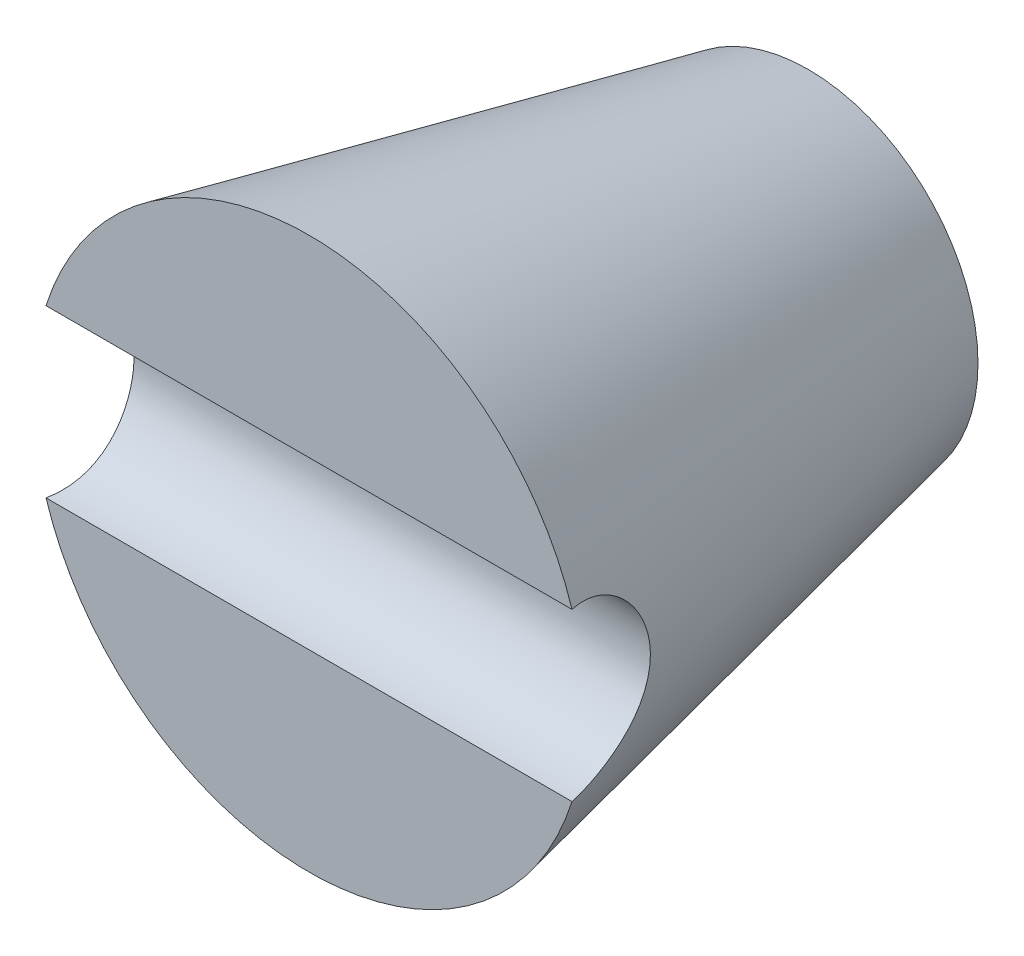
ISO-10303-21;
HEADER;
FILE_DESCRIPTION(('STEP AP214'),'2;1');
FILE_NAME('part.step','',(''),(''),'','','');
FILE_SCHEMA(('AUTOMOTIVE_DESIGN { 1 0 10303 214 1 1 1 1 }'));
ENDSEC;
DATA;
#1=APPLICATION_CONTEXT('core data for automotive mechanical design processes');
#2=APPLICATION_PROTOCOL_DEFINITION('international standard','automotive_design',2000,#1);
#3=PRODUCT_CONTEXT('',#1,'mechanical');
#4=PRODUCT('Part','Part','',(#3));
#5=PRODUCT_RELATED_PRODUCT_CATEGORY('part','',(#4));
#6=PRODUCT_DEFINITION_FORMATION('','',#4);
#7=PRODUCT_DEFINITION_CONTEXT('part definition',#1,'design');
#8=PRODUCT_DEFINITION('design','',#6,#7);
#9=PRODUCT_DEFINITION_SHAPE('','',#8);
#10=(LENGTH_UNIT() NAMED_UNIT(*) SI_UNIT(.MILLI.,.METRE.));
#11=(NAMED_UNIT(*) PLANE_ANGLE_UNIT() SI_UNIT($,.RADIAN.));
#12=(NAMED_UNIT(*) SI_UNIT($,.STERADIAN.) SOLID_ANGLE_UNIT());
#13=UNCERTAINTY_MEASURE_WITH_UNIT(LENGTH_MEASURE(1.E-05),#10,'distance_accuracy_value','');
#14=(GEOMETRIC_REPRESENTATION_CONTEXT(3) GLOBAL_UNCERTAINTY_ASSIGNED_CONTEXT((#13)) GLOBAL_UNIT_ASSIGNED_CONTEXT((#10,
#11,#12)) REPRESENTATION_CONTEXT('',''));
#15=CARTESIAN_POINT('',(0.,0.,0.));
#16=DIRECTION('',(0.,0.,1.));
#17=DIRECTION('',(1.,0.,0.));
#18=AXIS2_PLACEMENT_3D('',#15,#16,#17);
#19=CARTESIAN_POINT('',(0.,0.,90.));
#20=DIRECTION('',(0.,0.,1.));
#21=DIRECTION('',(1.,0.,0.));
#22=AXIS2_PLACEMENT_3D('',#19,#20,#21);
#23=PLANE('',#22);
#24=DIRECTION('',(1.,0.,0.));
#25=VECTOR('',#24,1.);
#26=CARTESIAN_POINT('',(-49.725090550302,-15.,90.));
#27=LINE('',#26,#25);
#28=CARTESIAN_POINT('',(-47.4086978331585,-15.,90.));
#29=VERTEX_POINT('',#28);
#30=CARTESIAN_POINT('',(47.4086978331585,-15.,90.));
#31=VERTEX_POINT('',#30);
#32=EDGE_CURVE('E11',#29,#31,#27,.T.);
#33=ORIENTED_EDGE('',*,*,#32,.F.);
#34=CARTESIAN_POINT('',(0.,0.,90.));
#35=DIRECTION('',(0.,0.,1.));
#36=DIRECTION('',(1.,0.,0.));
#37=AXIS2_PLACEMENT_3D('',#34,#35,#36);
#38=CIRCLE('',#37,49.725090550302);
#39=EDGE_CURVE('E71',#29,#31,#38,.T.);
#40=ORIENTED_EDGE('',*,*,#39,.T.);
#41=EDGE_LOOP('',(#33,#40));
#42=FACE_BOUND('',#41,.T.);
#43=ADVANCED_FACE('F37',(#42),#23,.T.);
#44=CARTESIAN_POINT('',(0.,0.,0.));
#45=DIRECTION('',(0.,0.,1.));
#46=DIRECTION('',(1.,0.,0.));
#47=AXIS2_PLACEMENT_3D('',#44,#45,#46);
#48=CONICAL_SURFACE('',#47,30.595,0.20943951023932);
#49=CARTESIAN_POINT('',(47.4086978331585,15.,90.));
#50=VERTEX_POINT('',#49);
#51=CARTESIAN_POINT('',(-47.4086978331585,15.,90.));
#52=VERTEX_POINT('',#51);
#53=EDGE_CURVE('E66',#50,#52,#38,.T.);
#54=ORIENTED_EDGE('',*,*,#53,.F.);
#55=CARTESIAN_POINT('',(47.4087424219969,14.9999999986667,90.0002));
#56=CARTESIAN_POINT('',(47.3641668779544,15.0000024875042,89.800268909812));
#57=CARTESIAN_POINT('',(47.32079901641,14.9960073704796,89.6000907778914));
#58=CARTESIAN_POINT('',(47.236565539021,14.9799676217304,89.1995245890494));
#59=CARTESIAN_POINT('',(47.1957000015638,14.9679227379804,88.9991365257514));
#60=CARTESIAN_POINT('',(47.0769981284179,14.919635134785,88.3981371824646));
#61=CARTESIAN_POINT('',(47.0030487890316,14.8712394824521,87.997656056656));
#62=CARTESIAN_POINT('',(46.8661548841138,14.7419707294051,87.2004921135172));
#63=CARTESIAN_POINT('',(46.8032004397948,14.6611270006085,86.8038061923681));
#64=CARTESIAN_POINT('',(46.6884204133676,14.4671423914558,86.0167842057948));
#65=CARTESIAN_POINT('',(46.6365939579315,14.3540040472153,85.6264476442949));
#66=CARTESIAN_POINT('',(46.543893750893,14.0957496159666,84.8545441693145));
#67=CARTESIAN_POINT('',(46.5030355834741,13.950588557353,84.472990430717));
#68=CARTESIAN_POINT('',(46.4319338269832,13.6292120592214,83.7221547226515));
#69=CARTESIAN_POINT('',(46.401690606467,13.4529955417628,83.3528731796825));
#70=CARTESIAN_POINT('',(46.3510965968484,13.0707271781923,82.6295616574894));
#71=CARTESIAN_POINT('',(46.3307421938531,12.8646862672625,82.2755261497369));
#72=CARTESIAN_POINT('',(46.2989176741939,12.4241381247958,81.585224770222));
#73=CARTESIAN_POINT('',(46.287447457934,12.1896312124111,81.2489586992948));
#74=CARTESIAN_POINT('',(46.2722564010358,11.6957983077513,80.59928470589));
#75=CARTESIAN_POINT('',(46.2684736815097,11.4366882120987,80.2857140137312));
#76=CARTESIAN_POINT('',(46.2671651606576,10.8938588186519,79.6806475422065));
#77=CARTESIAN_POINT('',(46.2696393352302,10.6101396156558,79.3891516778132));
#78=CARTESIAN_POINT('',(46.2794602143533,10.0199113471558,78.8301000041105));
#79=CARTESIAN_POINT('',(46.2868086831666,9.7133940655119,78.5625529029247));
#80=CARTESIAN_POINT('',(46.3049691911272,9.07970703067542,78.0532782816396));
#81=CARTESIAN_POINT('',(46.3157812983206,8.7525368718411,77.8115512689223));
#82=CARTESIAN_POINT('',(46.3397885257936,8.07112266845122,77.3496768897564));
#83=CARTESIAN_POINT('',(46.3530373495523,7.7164011682186,77.1302363805396));
#84=CARTESIAN_POINT('',(46.3803128052473,6.9899420411165,76.7216571983555));
#85=CARTESIAN_POINT('',(46.3943394488727,6.61820415854086,76.5325189809348));
#86=CARTESIAN_POINT('',(46.4218863888047,5.86028109841023,76.1858497318157));
#87=CARTESIAN_POINT('',(46.4354067180003,5.47409686252653,76.0283166442128));
#88=CARTESIAN_POINT('',(46.460825743328,4.68990628056153,75.7459319909908));
#89=CARTESIAN_POINT('',(46.472724435796,4.29189990777011,75.6210804992165));
#90=CARTESIAN_POINT('',(46.4941141981147,3.4818810722072,75.4036135471986));
#91=CARTESIAN_POINT('',(46.5035740480412,3.06975685387214,75.3114109423459));
#92=CARTESIAN_POINT('',(46.5191819576246,2.23913798833177,75.1620647861715));
#93=CARTESIAN_POINT('',(46.5253299859769,1.82064328094875,75.1049215662431));
#94=CARTESIAN_POINT('',(46.5338654449173,0.980285869505565,75.0261180250932));
#95=CARTESIAN_POINT('',(46.5362528656677,0.558423156637678,75.0044577966943));
#96=CARTESIAN_POINT('',(46.5370952452691,-0.285628224536407,74.9967825135279));
#97=CARTESIAN_POINT('',(46.5355502299292,-0.707816890685156,75.0107672248183));
#98=CARTESIAN_POINT('',(46.5286583803406,-1.54711619563618,75.074098104667));
#99=CARTESIAN_POINT('',(46.5233329295116,-1.9642420355953,75.1232453940257));
#100=CARTESIAN_POINT('',(46.5092865172089,-2.79284808880539,75.2563208895627));
#101=CARTESIAN_POINT('',(46.5005655646925,-3.20432831694645,75.3402490039897));
#102=CARTESIAN_POINT('',(46.4803710555732,-4.01875478822399,75.5422808027265));
#103=CARTESIAN_POINT('',(46.4688974083761,-4.42170075001281,75.6603856118573));
#104=CARTESIAN_POINT('',(46.4440812107136,-5.21622657282353,75.9299266580788));
#105=CARTESIAN_POINT('',(46.4307386518564,-5.60780638279946,76.0813630448372));
#106=CARTESIAN_POINT('',(46.4032476563283,-6.37781032512902,76.4169098609023));
#107=CARTESIAN_POINT('',(46.3890973428694,-6.75620023198064,76.6010986771807));
#108=CARTESIAN_POINT('',(46.3613053596279,-7.49618813179242,77.0006167965818));
#109=CARTESIAN_POINT('',(46.347663691235,-7.85778607887989,77.2159461847685));
#110=CARTESIAN_POINT('',(46.3223139720355,-8.56168923797824,77.6762695577587));
#111=CARTESIAN_POINT('',(46.3106060512468,-8.9039931517132,77.9212655353131));
#112=CARTESIAN_POINT('',(46.290645589653,-9.56687020122631,78.4392080947055));
#113=CARTESIAN_POINT('',(46.2823930419137,-9.88744338061175,78.7121546204522));
#114=CARTESIAN_POINT('',(46.2708943453075,-10.5051718764111,79.284635531107));
#115=CARTESIAN_POINT('',(46.2676579947428,-10.802280287255,79.5842207469729));
#116=CARTESIAN_POINT('',(46.2677755615236,-11.3702174314398,80.2073566299126));
#117=CARTESIAN_POINT('',(46.271129526816,-11.6410459735701,80.5309074713284));
#118=CARTESIAN_POINT('',(46.2858943093209,-12.1543825013139,81.1995116987492));
#119=CARTESIAN_POINT('',(46.2973040212666,-12.3968943667216,81.5445621290407));
#120=CARTESIAN_POINT('',(46.3294894011764,-12.8518335342083,82.253532446411));
#121=CARTESIAN_POINT('',(46.3502646509918,-13.0642621788746,82.6174514904097));
#122=CARTESIAN_POINT('',(46.4016927092214,-13.453185777386,83.3531137836705));
#123=CARTESIAN_POINT('',(46.4321188914904,-13.6303666440639,83.7245103863963));
#124=CARTESIAN_POINT('',(46.5037138931441,-13.9533325379453,84.4797471852229));
#125=CARTESIAN_POINT('',(46.544883462025,-14.0991153734162,84.8635882478561));
#126=CARTESIAN_POINT('',(46.6383762011381,-14.3583430446047,85.6404620659496));
#127=CARTESIAN_POINT('',(46.6906929440419,-14.4718064276099,86.0334894089385));
#128=CARTESIAN_POINT('',(46.8065767879962,-14.6659685985225,86.8257776784182));
#129=CARTESIAN_POINT('',(46.870140032651,-14.7466785863376,87.2250364255243));
#130=CARTESIAN_POINT('',(47.0072431669457,-14.8742052675002,88.0206726851792));
#131=CARTESIAN_POINT('',(47.0806128133667,-14.9215287941362,88.4169986690864));
#132=CARTESIAN_POINT('',(47.2373273426304,-14.9844174513304,89.2093167747981));
#133=CARTESIAN_POINT('',(47.3206505581045,-15.0000502801641,89.6053077981233));
#134=CARTESIAN_POINT('',(47.4087424219969,-14.9999999986667,90.0002));
#135=B_SPLINE_CURVE_WITH_KNOTS('',3,(#55,#56,#57,#58,#59,#60,#61,#62,#63,#64,#65,#66,#67,#68,
#69,#70,#71,#72,#73,#74,#75,#76,#77,#78,#79,#80,#81,#82,#83,#84,#85,#86,#87,#88,#89,#90,#91,#92,
#93,#94,#95,#96,#97,#98,#99,#100,#101,#102,#103,#104,#105,#106,#107,#108,#109,#110,#111,#112,
#113,#114,#115,#116,#117,#118,#119,#120,#121,#122,#123,#124,#125,#126,#127,#128,#129,#130,#131,
#132,#133,#134),.UNSPECIFIED.,.F.,.F.,(4,2,2,2,2,2,2,2,2,2,2,2,2,2,2,2,2,2,2,2,2,2,2,2,2,2,2,2,
2,2,2,2,2,2,2,2,2,2,2,4),(0.,0.614432205927881,1.228883649654,2.45768022851433,3.68536700334921,
4.91295739371212,6.14228287119773,7.37165102720522,8.60056956898271,9.82947433377163,
11.0484474714055,12.2674159135763,13.486825805273,14.7062596547736,15.9567672443423,
17.2072936315336,18.4577386459531,19.7081864857578,20.9739249755452,22.2396754293396,
23.5054291943001,24.7711746519897,26.0298170932928,27.2884562143333,28.5471367643256,
29.8058229662444,31.0675631751613,32.3293068307283,33.5911352866372,34.8529612103458,
36.1172488075485,37.3815456029388,38.645668967617,39.9097358978144,41.1460795027648,
42.3825093824525,43.618228271254,44.8535242535833,46.0696386029532,47.2831523162796),.UNSPECIFIED.);
#136=EDGE_CURVE('E52',#50,#31,#135,.T.);
#137=ORIENTED_EDGE('',*,*,#136,.T.);
#138=ORIENTED_EDGE('',*,*,#39,.F.);
#139=CARTESIAN_POINT('',(-47.4087424219969,-14.9999999986667,90.0002));
#140=CARTESIAN_POINT('',(-47.3641668779544,-15.0000024875042,89.800268909812));
#141=CARTESIAN_POINT('',(-47.32079901641,-14.9960073704796,89.6000907778914));
#142=CARTESIAN_POINT('',(-47.236565539021,-14.9799676217304,89.1995245890494));
#143=CARTESIAN_POINT('',(-47.1957000015638,-14.9679227379804,88.9991365257514));
#144=CARTESIAN_POINT('',(-47.0769981284179,-14.919635134785,88.3981371824646));
#145=CARTESIAN_POINT('',(-47.0030487890316,-14.8712394824521,87.997656056656));
#146=CARTESIAN_POINT('',(-46.8661548841138,-14.7419707294051,87.2004921135172));
#147=CARTESIAN_POINT('',(-46.8032004397948,-14.6611270006085,86.8038061923681));
#148=CARTESIAN_POINT('',(-46.6884204133676,-14.4671423914558,86.0167842057948));
#149=CARTESIAN_POINT('',(-46.6365939579315,-14.3540040472153,85.6264476442949));
#150=CARTESIAN_POINT('',(-46.543893750893,-14.0957496159666,84.8545441693145));
#151=CARTESIAN_POINT('',(-46.5030355834741,-13.950588557353,84.472990430717));
#152=CARTESIAN_POINT('',(-46.4319338269832,-13.6292120592214,83.7221547226515));
#153=CARTESIAN_POINT('',(-46.401690606467,-13.4529955417628,83.3528731796825));
#154=CARTESIAN_POINT('',(-46.3510965968484,-13.0707271781923,82.6295616574894));
#155=CARTESIAN_POINT('',(-46.3307421938531,-12.8646862672625,82.2755261497369));
#156=CARTESIAN_POINT('',(-46.2989176741939,-12.4241381247958,81.585224770222));
#157=CARTESIAN_POINT('',(-46.287447457934,-12.1896312124111,81.2489586992948));
#158=CARTESIAN_POINT('',(-46.2722564010358,-11.6957983077513,80.59928470589));
#159=CARTESIAN_POINT('',(-46.2684736815097,-11.4366882120987,80.2857140137312));
#160=CARTESIAN_POINT('',(-46.2671651606576,-10.8938588186519,79.6806475422065));
#161=CARTESIAN_POINT('',(-46.2696393352302,-10.6101396156558,79.3891516778132));
#162=CARTESIAN_POINT('',(-46.2794602143533,-10.0199113471558,78.8301000041105));
#163=CARTESIAN_POINT('',(-46.2868086831666,-9.7133940655119,78.5625529029247));
#164=CARTESIAN_POINT('',(-46.3049691911272,-9.07970703067542,78.0532782816396));
#165=CARTESIAN_POINT('',(-46.3157812983206,-8.7525368718411,77.8115512689223));
#166=CARTESIAN_POINT('',(-46.3397885257936,-8.07112266845122,77.3496768897564));
#167=CARTESIAN_POINT('',(-46.3530373495523,-7.7164011682186,77.1302363805396));
#168=CARTESIAN_POINT('',(-46.3803128052473,-6.9899420411165,76.7216571983555));
#169=CARTESIAN_POINT('',(-46.3943394488727,-6.61820415854086,76.5325189809348));
#170=CARTESIAN_POINT('',(-46.4218863888047,-5.86028109841023,76.1858497318157));
#171=CARTESIAN_POINT('',(-46.4354067180003,-5.47409686252653,76.0283166442128));
#172=CARTESIAN_POINT('',(-46.460825743328,-4.68990628056153,75.7459319909908));
#173=CARTESIAN_POINT('',(-46.472724435796,-4.29189990777011,75.6210804992165));
#174=CARTESIAN_POINT('',(-46.4941141981147,-3.4818810722072,75.4036135471986));
#175=CARTESIAN_POINT('',(-46.5035740480412,-3.06975685387214,75.3114109423459));
#176=CARTESIAN_POINT('',(-46.5191819576246,-2.23913798833177,75.1620647861715));
#177=CARTESIAN_POINT('',(-46.5253299859769,-1.82064328094875,75.1049215662431));
#178=CARTESIAN_POINT('',(-46.5338654449173,-0.980285869505565,75.0261180250932));
#179=CARTESIAN_POINT('',(-46.5362528656677,-0.558423156637678,75.0044577966943));
#180=CARTESIAN_POINT('',(-46.5370952452691,0.285628224536408,74.9967825135279));
#181=CARTESIAN_POINT('',(-46.5355502299292,0.707816890685157,75.0107672248183));
#182=CARTESIAN_POINT('',(-46.5286583803406,1.54711619563618,75.074098104667));
#183=CARTESIAN_POINT('',(-46.5233329295116,1.9642420355953,75.1232453940257));
#184=CARTESIAN_POINT('',(-46.5092865172089,2.79284808880538,75.2563208895627));
#185=CARTESIAN_POINT('',(-46.5005655646925,3.20432831694645,75.3402490039896));
#186=CARTESIAN_POINT('',(-46.4803710555732,4.01875478822399,75.5422808027265));
#187=CARTESIAN_POINT('',(-46.4688974083761,4.42170075001281,75.6603856118573));
#188=CARTESIAN_POINT('',(-46.4440812107136,5.21622657282353,75.9299266580788));
#189=CARTESIAN_POINT('',(-46.4307386518564,5.60780638279945,76.0813630448372));
#190=CARTESIAN_POINT('',(-46.4032476563283,6.37781032512902,76.4169098609023));
#191=CARTESIAN_POINT('',(-46.3890973428694,6.75620023198064,76.6010986771807));
#192=CARTESIAN_POINT('',(-46.3613053596279,7.49618813179242,77.0006167965818));
#193=CARTESIAN_POINT('',(-46.347663691235,7.85778607887989,77.2159461847685));
#194=CARTESIAN_POINT('',(-46.3223139720355,8.56168923797824,77.6762695577587));
#195=CARTESIAN_POINT('',(-46.3106060512468,8.9039931517132,77.9212655353131));
#196=CARTESIAN_POINT('',(-46.290645589653,9.56687020122631,78.4392080947055));
#197=CARTESIAN_POINT('',(-46.2823930419137,9.88744338061175,78.7121546204522));
#198=CARTESIAN_POINT('',(-46.2708943453075,10.5051718764111,79.284635531107));
#199=CARTESIAN_POINT('',(-46.2676579947428,10.802280287255,79.5842207469729));
#200=CARTESIAN_POINT('',(-46.2677755615236,11.3702174314398,80.2073566299126));
#201=CARTESIAN_POINT('',(-46.271129526816,11.6410459735701,80.5309074713284));
#202=CARTESIAN_POINT('',(-46.2858943093209,12.1543825013139,81.1995116987492));
#203=CARTESIAN_POINT('',(-46.2973040212666,12.3968943667216,81.5445621290407));
#204=CARTESIAN_POINT('',(-46.3294894011764,12.8518335342083,82.253532446411));
#205=CARTESIAN_POINT('',(-46.3502646509918,13.0642621788746,82.6174514904097));
#206=CARTESIAN_POINT('',(-46.4016927092214,13.453185777386,83.3531137836704));
#207=CARTESIAN_POINT('',(-46.4321188914904,13.6303666440639,83.7245103863963));
#208=CARTESIAN_POINT('',(-46.5037138931441,13.9533325379452,84.4797471852229));
#209=CARTESIAN_POINT('',(-46.544883462025,14.0991153734162,84.8635882478561));
#210=CARTESIAN_POINT('',(-46.6383762011381,14.3583430446047,85.6404620659496));
#211=CARTESIAN_POINT('',(-46.6906929440419,14.4718064276099,86.0334894089385));
#212=CARTESIAN_POINT('',(-46.8065767879962,14.6659685985225,86.8257776784182));
#213=CARTESIAN_POINT('',(-46.870140032651,14.7466785863376,87.2250364255243));
#214=CARTESIAN_POINT('',(-47.0072431669457,14.8742052675002,88.0206726851792));
#215=CARTESIAN_POINT('',(-47.0806128133667,14.9215287941362,88.4169986690864));
#216=CARTESIAN_POINT('',(-47.2373273426304,14.9844174513304,89.2093167747981));
#217=CARTESIAN_POINT('',(-47.3206505581045,15.0000502801641,89.6053077981233));
#218=CARTESIAN_POINT('',(-47.4087424219969,14.9999999986667,90.0002));
#219=B_SPLINE_CURVE_WITH_KNOTS('',3,(#139,#140,#141,#142,#143,#144,#145,#146,#147,#148,#149,
#150,#151,#152,#153,#154,#155,#156,#157,#158,#159,#160,#161,#162,#163,#164,#165,#166,#167,#168,
#169,#170,#171,#172,#173,#174,#175,#176,#177,#178,#179,#180,#181,#182,#183,#184,#185,#186,#187,
#188,#189,#190,#191,#192,#193,#194,#195,#196,#197,#198,#199,#200,#201,#202,#203,#204,#205,#206,
#207,#208,#209,#210,#211,#212,#213,#214,#215,#216,#217,#218),.UNSPECIFIED.,.F.,.F.,(4,2,2,2,2,2,
2,2,2,2,2,2,2,2,2,2,2,2,2,2,2,2,2,2,2,2,2,2,2,2,2,2,2,2,2,2,2,2,2,4),(0.,0.614432205927881,
1.228883649654,2.45768022851433,3.68536700334921,4.91295739371212,6.14228287119773,
7.37165102720522,8.60056956898271,9.82947433377163,11.0484474714055,12.2674159135763,
13.486825805273,14.7062596547736,15.9567672443423,17.2072936315336,18.4577386459531,
19.7081864857578,20.9739249755452,22.2396754293396,23.5054291943001,24.7711746519897,
26.0298170932928,27.2884562143333,28.5471367643256,29.8058229662444,31.0675631751613,
32.3293068307284,33.5911352866372,34.8529612103458,36.1172488075485,37.3815456029388,
38.645668967617,39.9097358978144,41.1460795027648,42.3825093824525,43.618228271254,
44.8535242535833,46.0696386029532,47.2831523162796),.UNSPECIFIED.);
#220=EDGE_CURVE('E62',#29,#52,#219,.T.);
#221=ORIENTED_EDGE('',*,*,#220,.T.);
#222=EDGE_LOOP('',(#54,#137,#138,#221));
#223=FACE_BOUND('',#222,.T.);
#224=CARTESIAN_POINT('',(0.,0.,0.));
#225=DIRECTION('',(0.,0.,1.));
#226=DIRECTION('',(1.,0.,0.));
#227=AXIS2_PLACEMENT_3D('',#224,#225,#226);
#228=CIRCLE('',#227,30.595);
#229=CARTESIAN_POINT('',(30.595,0.,0.));
#230=VERTEX_POINT('',#229);
#231=EDGE_CURVE('E75',#230,#230,#228,.T.);
#232=ORIENTED_EDGE('',*,*,#231,.T.);
#233=EDGE_LOOP('',(#232));
#234=FACE_BOUND('',#233,.T.);
#235=ADVANCED_FACE('F39',(#223,#234),#48,.T.);
#236=DIRECTION('',(1.,0.,0.));
#237=VECTOR('',#236,1.);
#238=CARTESIAN_POINT('',(-49.725090550302,15.,90.));
#239=LINE('',#238,#237);
#240=EDGE_CURVE('E46',#50,#52,#239,.F.);
#241=ORIENTED_EDGE('',*,*,#240,.F.);
#242=ORIENTED_EDGE('',*,*,#53,.T.);
#243=EDGE_LOOP('',(#241,#242));
#244=FACE_BOUND('',#243,.T.);
#245=ADVANCED_FACE('F73',(#244),#23,.T.);
#246=CARTESIAN_POINT('',(0.,0.,0.));
#247=DIRECTION('',(0.,0.,1.));
#248=DIRECTION('',(1.,0.,0.));
#249=AXIS2_PLACEMENT_3D('',#246,#247,#248);
#250=PLANE('',#249);
#251=CARTESIAN_POINT('',(0.,0.,0.));
#252=DIRECTION('',(0.,0.,-1.));
#253=DIRECTION('',(-1.,0.,0.));
#254=AXIS2_PLACEMENT_3D('',#251,#252,#253);
#255=CIRCLE('',#254,15.);
#256=CARTESIAN_POINT('',(-15.,0.,0.));
#257=VERTEX_POINT('',#256);
#258=EDGE_CURVE('E80',#257,#257,#255,.T.);
#259=ORIENTED_EDGE('',*,*,#258,.F.);
#260=EDGE_LOOP('',(#259));
#261=FACE_BOUND('',#260,.T.);
#262=ORIENTED_EDGE('',*,*,#231,.F.);
#263=EDGE_LOOP('',(#262));
#264=FACE_BOUND('',#263,.T.);
#265=ADVANCED_FACE('F103',(#261,#264),#250,.F.);
#266=CARTESIAN_POINT('',(0.,0.,50.));
#267=DIRECTION('',(0.,0.,-1.));
#268=DIRECTION('',(-1.,0.,0.));
#269=AXIS2_PLACEMENT_3D('',#266,#267,#268);
#270=CYLINDRICAL_SURFACE('',#269,15.);
#271=CARTESIAN_POINT('',(0.,0.,50.));
#272=DIRECTION('',(0.,0.,-1.));
#273=DIRECTION('',(-1.,0.,0.));
#274=AXIS2_PLACEMENT_3D('',#271,#272,#273);
#275=CIRCLE('',#274,15.);
#276=CARTESIAN_POINT('',(-15.,0.,50.));
#277=VERTEX_POINT('',#276);
#278=EDGE_CURVE('E79',#277,#277,#275,.T.);
#279=ORIENTED_EDGE('',*,*,#278,.F.);
#280=EDGE_LOOP('',(#279));
#281=FACE_BOUND('',#280,.T.);
#282=ORIENTED_EDGE('',*,*,#258,.T.);
#283=EDGE_LOOP('',(#282));
#284=FACE_BOUND('',#283,.T.);
#285=ADVANCED_FACE('F99',(#281,#284),#270,.F.);
#286=CARTESIAN_POINT('',(0.,0.,50.));
#287=DIRECTION('',(0.,0.,-1.));
#288=DIRECTION('',(-1.,0.,0.));
#289=AXIS2_PLACEMENT_3D('',#286,#287,#288);
#290=PLANE('',#289);
#291=ORIENTED_EDGE('',*,*,#278,.T.);
#292=EDGE_LOOP('',(#291));
#293=FACE_BOUND('',#292,.T.);
#294=ADVANCED_FACE('F95',(#293),#290,.T.);
#295=CARTESIAN_POINT('',(-49.725090550302,0.,90.));
#296=DIRECTION('',(1.,0.,0.));
#297=DIRECTION('',(0.,0.,-1.));
#298=AXIS2_PLACEMENT_3D('',#295,#296,#297);
#299=CYLINDRICAL_SURFACE('',#298,15.);
#300=ORIENTED_EDGE('',*,*,#32,.T.);
#301=ORIENTED_EDGE('',*,*,#136,.F.);
#302=ORIENTED_EDGE('',*,*,#240,.T.);
#303=ORIENTED_EDGE('',*,*,#220,.F.);
#304=EDGE_LOOP('',(#300,#301,#302,#303));
#305=FACE_BOUND('',#304,.T.);
#306=ADVANCED_FACE('F61',(#305),#299,.F.);
#307=CLOSED_SHELL('',(#43,#235,#245,#265,#285,#294,#306));
#308=MANIFOLD_SOLID_BREP('B2',#307);
#309=ADVANCED_BREP_SHAPE_REPRESENTATION('',(#18,#308),#14);
#310=SHAPE_DEFINITION_REPRESENTATION(#9,#309);
ENDSEC;
END-ISO-10303-21;
